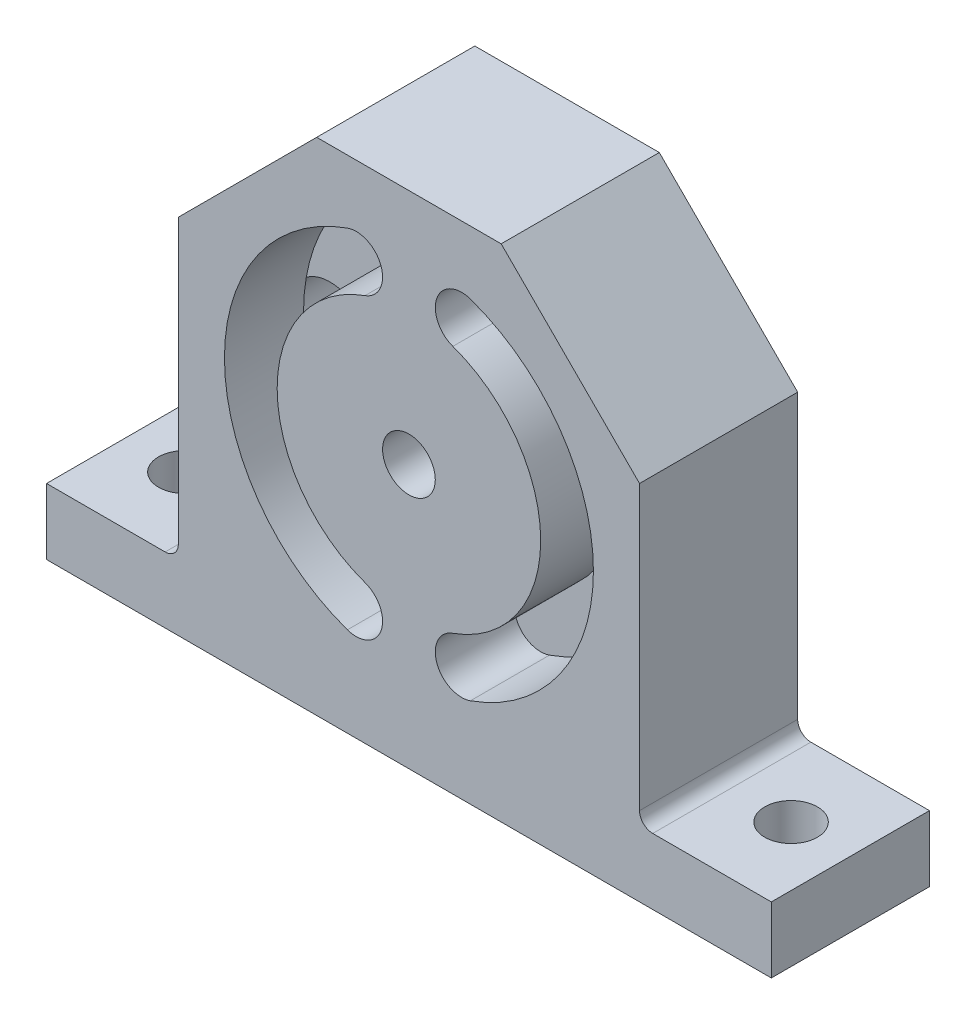
ISO-10303-21;
HEADER;
FILE_DESCRIPTION(('STEP AP214'),'2;1');
FILE_NAME('part.step','',(''),(''),'','','');
FILE_SCHEMA(('AUTOMOTIVE_DESIGN { 1 0 10303 214 1 1 1 1 }'));
ENDSEC;
DATA;
#1=APPLICATION_CONTEXT('core data for automotive mechanical design processes');
#2=APPLICATION_PROTOCOL_DEFINITION('international standard','automotive_design',2000,#1);
#3=PRODUCT_CONTEXT('',#1,'mechanical');
#4=PRODUCT('Part','Part','',(#3));
#5=PRODUCT_RELATED_PRODUCT_CATEGORY('part','',(#4));
#6=PRODUCT_DEFINITION_FORMATION('','',#4);
#7=PRODUCT_DEFINITION_CONTEXT('part definition',#1,'design');
#8=PRODUCT_DEFINITION('design','',#6,#7);
#9=PRODUCT_DEFINITION_SHAPE('','',#8);
#10=(LENGTH_UNIT() NAMED_UNIT(*) SI_UNIT(.MILLI.,.METRE.));
#11=(NAMED_UNIT(*) PLANE_ANGLE_UNIT() SI_UNIT($,.RADIAN.));
#12=(NAMED_UNIT(*) SI_UNIT($,.STERADIAN.) SOLID_ANGLE_UNIT());
#13=UNCERTAINTY_MEASURE_WITH_UNIT(LENGTH_MEASURE(1.E-05),#10,'distance_accuracy_value','');
#14=(GEOMETRIC_REPRESENTATION_CONTEXT(3) GLOBAL_UNCERTAINTY_ASSIGNED_CONTEXT((#13)) GLOBAL_UNIT_ASSIGNED_CONTEXT((#10,
#11,#12)) REPRESENTATION_CONTEXT('',''));
#15=CARTESIAN_POINT('',(0.,0.,0.));
#16=DIRECTION('',(0.,0.,1.));
#17=DIRECTION('',(1.,0.,0.));
#18=AXIS2_PLACEMENT_3D('',#15,#16,#17);
#19=CARTESIAN_POINT('',(25.5,14.3431457505076,0.));
#20=DIRECTION('',(0.,0.,1.));
#21=DIRECTION('',(1.,0.,0.));
#22=AXIS2_PLACEMENT_3D('',#19,#20,#21);
#23=PLANE('',#22);
#24=CARTESIAN_POINT('',(27.5,20.,0.));
#25=DIRECTION('',(0.,0.,1.));
#26=DIRECTION('',(1.,0.,0.));
#27=AXIS2_PLACEMENT_3D('',#24,#25,#26);
#28=CIRCLE('',#27,14.);
#29=CARTESIAN_POINT('',(22.8333333333333,33.1993265821489,0.));
#30=VERTEX_POINT('',#29);
#31=CARTESIAN_POINT('',(13.7083333333333,22.4062274529968,0.));
#32=VERTEX_POINT('',#31);
#33=EDGE_CURVE('E223',#30,#32,#28,.T.);
#34=ORIENTED_EDGE('',*,*,#33,.T.);
#35=CARTESIAN_POINT('',(15.5,20.,0.));
#36=DIRECTION('',(0.,0.,-1.));
#37=DIRECTION('',(-1.,0.,0.));
#38=AXIS2_PLACEMENT_3D('',#35,#36,#37);
#39=CIRCLE('',#38,3.);
#40=CARTESIAN_POINT('',(17.7083333333333,22.0305821551685,0.));
#41=VERTEX_POINT('',#40);
#42=EDGE_CURVE('E207',#32,#41,#39,.T.);
#43=ORIENTED_EDGE('',*,*,#42,.T.);
#44=CARTESIAN_POINT('',(27.5,20.,0.));
#45=DIRECTION('',(0.,0.,-1.));
#46=DIRECTION('',(1.,0.,0.));
#47=AXIS2_PLACEMENT_3D('',#44,#45,#46);
#48=CIRCLE('',#47,10.);
#49=CARTESIAN_POINT('',(24.1666666666667,29.4280904158206,0.));
#50=VERTEX_POINT('',#49);
#51=EDGE_CURVE('E242',#41,#50,#48,.T.);
#52=ORIENTED_EDGE('',*,*,#51,.T.);
#53=CARTESIAN_POINT('',(23.5,31.3137084989848,0.));
#54=DIRECTION('',(0.,0.,1.));
#55=DIRECTION('',(1.,0.,0.));
#56=AXIS2_PLACEMENT_3D('',#53,#54,#55);
#57=CIRCLE('',#56,2.);
#58=EDGE_CURVE('E229',#50,#30,#57,.T.);
#59=ORIENTED_EDGE('',*,*,#58,.T.);
#60=EDGE_LOOP('',(#34,#43,#52,#59));
#61=FACE_BOUND('',#60,.T.);
#62=ADVANCED_FACE('F37',(#61),#23,.T.);
#63=CARTESIAN_POINT('',(29.5,25.6568542494924,0.));
#64=DIRECTION('',(0.,0.,1.));
#65=DIRECTION('',(1.,0.,0.));
#66=AXIS2_PLACEMENT_3D('',#63,#64,#65);
#67=PLANE('',#66);
#68=CARTESIAN_POINT('',(27.5,20.,0.));
#69=DIRECTION('',(0.,0.,-1.));
#70=DIRECTION('',(1.,0.,0.));
#71=AXIS2_PLACEMENT_3D('',#68,#69,#70);
#72=CIRCLE('',#71,9.99999999999999);
#73=CARTESIAN_POINT('',(30.8333333333333,29.4280904158206,0.));
#74=VERTEX_POINT('',#73);
#75=CARTESIAN_POINT('',(37.2916666666667,22.0305821551685,0.));
#76=VERTEX_POINT('',#75);
#77=EDGE_CURVE('E273',#74,#76,#72,.T.);
#78=ORIENTED_EDGE('',*,*,#77,.T.);
#79=CARTESIAN_POINT('',(39.5,20.,0.));
#80=DIRECTION('',(0.,0.,-1.));
#81=DIRECTION('',(-1.,0.,0.));
#82=AXIS2_PLACEMENT_3D('',#79,#80,#81);
#83=CIRCLE('',#82,3.);
#84=CARTESIAN_POINT('',(41.2916666666667,22.4062274529968,0.));
#85=VERTEX_POINT('',#84);
#86=EDGE_CURVE('E291',#76,#85,#83,.T.);
#87=ORIENTED_EDGE('',*,*,#86,.T.);
#88=CARTESIAN_POINT('',(27.5,20.,0.));
#89=DIRECTION('',(0.,0.,1.));
#90=DIRECTION('',(1.,0.,0.));
#91=AXIS2_PLACEMENT_3D('',#88,#89,#90);
#92=CIRCLE('',#91,14.);
#93=CARTESIAN_POINT('',(32.1666666666667,33.1993265821489,0.));
#94=VERTEX_POINT('',#93);
#95=EDGE_CURVE('E261',#85,#94,#92,.T.);
#96=ORIENTED_EDGE('',*,*,#95,.T.);
#97=CARTESIAN_POINT('',(31.5,31.3137084989848,0.));
#98=DIRECTION('',(0.,0.,1.));
#99=DIRECTION('',(-1.,0.,0.));
#100=AXIS2_PLACEMENT_3D('',#97,#98,#99);
#101=CIRCLE('',#100,2.);
#102=EDGE_CURVE('E278',#94,#74,#101,.T.);
#103=ORIENTED_EDGE('',*,*,#102,.T.);
#104=EDGE_LOOP('',(#78,#87,#96,#103));
#105=FACE_BOUND('',#104,.T.);
#106=ADVANCED_FACE('F464',(#105),#67,.T.);
#107=CARTESIAN_POINT('',(0.,0.,6.));
#108=DIRECTION('',(0.,0.,1.));
#109=DIRECTION('',(1.,0.,0.));
#110=AXIS2_PLACEMENT_3D('',#107,#108,#109);
#111=PLANE('',#110);
#112=CARTESIAN_POINT('',(23.5,8.68629150101523,6.));
#113=DIRECTION('',(0.,0.,1.));
#114=DIRECTION('',(1.,0.,0.));
#115=AXIS2_PLACEMENT_3D('',#112,#113,#114);
#116=CIRCLE('',#115,2.);
#117=CARTESIAN_POINT('',(22.8333333333333,6.8006734178511,6.));
#118=VERTEX_POINT('',#117);
#119=CARTESIAN_POINT('',(24.1666666666667,10.5719095841794,6.));
#120=VERTEX_POINT('',#119);
#121=EDGE_CURVE('E294',#118,#120,#116,.T.);
#122=ORIENTED_EDGE('',*,*,#121,.F.);
#123=CARTESIAN_POINT('',(27.5,20.,6.));
#124=DIRECTION('',(0.,0.,1.));
#125=DIRECTION('',(1.,0.,0.));
#126=AXIS2_PLACEMENT_3D('',#123,#124,#125);
#127=CIRCLE('',#126,14.);
#128=CARTESIAN_POINT('',(22.8333333333333,33.1993265821489,6.));
#129=VERTEX_POINT('',#128);
#130=EDGE_CURVE('E246',#129,#118,#127,.T.);
#131=ORIENTED_EDGE('',*,*,#130,.F.);
#132=CARTESIAN_POINT('',(23.5,31.3137084989848,6.));
#133=DIRECTION('',(0.,0.,1.));
#134=DIRECTION('',(1.,0.,0.));
#135=AXIS2_PLACEMENT_3D('',#132,#133,#134);
#136=CIRCLE('',#135,2.);
#137=CARTESIAN_POINT('',(24.1666666666667,29.4280904158206,6.));
#138=VERTEX_POINT('',#137);
#139=EDGE_CURVE('E500',#138,#129,#136,.T.);
#140=ORIENTED_EDGE('',*,*,#139,.F.);
#141=CARTESIAN_POINT('',(27.5,20.,6.));
#142=DIRECTION('',(0.,0.,-1.));
#143=DIRECTION('',(1.,0.,0.));
#144=AXIS2_PLACEMENT_3D('',#141,#142,#143);
#145=CIRCLE('',#144,10.);
#146=EDGE_CURVE('E494',#120,#138,#145,.T.);
#147=ORIENTED_EDGE('',*,*,#146,.F.);
#148=EDGE_LOOP('',(#122,#131,#140,#147));
#149=FACE_BOUND('',#148,.T.);
#150=CARTESIAN_POINT('',(27.5,20.,6.));
#151=DIRECTION('',(0.,0.,1.));
#152=DIRECTION('',(1.,0.,0.));
#153=AXIS2_PLACEMENT_3D('',#150,#151,#152);
#154=CIRCLE('',#153,2.);
#155=CARTESIAN_POINT('',(29.5,20.,6.));
#156=VERTEX_POINT('',#155);
#157=EDGE_CURVE('E257',#156,#156,#154,.T.);
#158=ORIENTED_EDGE('',*,*,#157,.F.);
#159=EDGE_LOOP('',(#158));
#160=FACE_BOUND('',#159,.T.);
#161=DIRECTION('',(0.,-1.,0.));
#162=VECTOR('',#161,1.);
#163=CARTESIAN_POINT('',(0.,5.,6.));
#164=LINE('',#163,#162);
#165=CARTESIAN_POINT('',(0.,5.,6.));
#166=VERTEX_POINT('',#165);
#167=CARTESIAN_POINT('',(0.,0.,6.));
#168=VERTEX_POINT('',#167);
#169=EDGE_CURVE('E396',#166,#168,#164,.T.);
#170=ORIENTED_EDGE('',*,*,#169,.T.);
#171=DIRECTION('',(1.,0.,0.));
#172=VECTOR('',#171,1.);
#173=CARTESIAN_POINT('',(0.,0.,6.));
#174=LINE('',#173,#172);
#175=CARTESIAN_POINT('',(55.,0.,6.));
#176=VERTEX_POINT('',#175);
#177=EDGE_CURVE('E450',#168,#176,#174,.T.);
#178=ORIENTED_EDGE('',*,*,#177,.T.);
#179=DIRECTION('',(0.,1.,0.));
#180=VECTOR('',#179,1.);
#181=CARTESIAN_POINT('',(55.,0.,6.));
#182=LINE('',#181,#180);
#183=CARTESIAN_POINT('',(55.,5.00000000000001,6.));
#184=VERTEX_POINT('',#183);
#185=EDGE_CURVE('E418',#176,#184,#182,.T.);
#186=ORIENTED_EDGE('',*,*,#185,.T.);
#187=DIRECTION('',(-1.,0.,0.));
#188=VECTOR('',#187,1.);
#189=CARTESIAN_POINT('',(55.,5.00000000000001,6.));
#190=LINE('',#189,#188);
#191=CARTESIAN_POINT('',(46.,5.,6.));
#192=VERTEX_POINT('',#191);
#193=EDGE_CURVE('E428',#184,#192,#190,.T.);
#194=ORIENTED_EDGE('',*,*,#193,.T.);
#195=CARTESIAN_POINT('',(46.,6.,6.));
#196=DIRECTION('',(0.,0.,1.));
#197=DIRECTION('',(1.,0.,0.));
#198=AXIS2_PLACEMENT_3D('',#195,#196,#197);
#199=CIRCLE('',#198,1.);
#200=CARTESIAN_POINT('',(45.,6.,6.));
#201=VERTEX_POINT('',#200);
#202=EDGE_CURVE('E11',#192,#201,#199,.F.);
#203=ORIENTED_EDGE('',*,*,#202,.T.);
#204=DIRECTION('',(0.,1.,0.));
#205=VECTOR('',#204,1.);
#206=CARTESIAN_POINT('',(45.,5.,6.));
#207=LINE('',#206,#205);
#208=CARTESIAN_POINT('',(45.,27.5,6.));
#209=VERTEX_POINT('',#208);
#210=EDGE_CURVE('E426',#201,#209,#207,.T.);
#211=ORIENTED_EDGE('',*,*,#210,.T.);
#212=DIRECTION('',(-0.707106781186547,0.707106781186548,0.));
#213=VECTOR('',#212,1.);
#214=CARTESIAN_POINT('',(45.,27.5,6.));
#215=LINE('',#214,#213);
#216=CARTESIAN_POINT('',(34.5,38.,6.));
#217=VERTEX_POINT('',#216);
#218=EDGE_CURVE('E432',#209,#217,#215,.T.);
#219=ORIENTED_EDGE('',*,*,#218,.T.);
#220=DIRECTION('',(-1.,0.,0.));
#221=VECTOR('',#220,1.);
#222=CARTESIAN_POINT('',(34.5,38.,6.));
#223=LINE('',#222,#221);
#224=CARTESIAN_POINT('',(20.5,38.,6.));
#225=VERTEX_POINT('',#224);
#226=EDGE_CURVE('E369',#217,#225,#223,.T.);
#227=ORIENTED_EDGE('',*,*,#226,.T.);
#228=DIRECTION('',(-0.707106781186548,-0.707106781186547,0.));
#229=VECTOR('',#228,1.);
#230=CARTESIAN_POINT('',(20.5,38.,6.));
#231=LINE('',#230,#229);
#232=CARTESIAN_POINT('',(10.,27.5,6.));
#233=VERTEX_POINT('',#232);
#234=EDGE_CURVE('E364',#225,#233,#231,.T.);
#235=ORIENTED_EDGE('',*,*,#234,.T.);
#236=DIRECTION('',(0.,-1.,0.));
#237=VECTOR('',#236,1.);
#238=CARTESIAN_POINT('',(10.,27.5,6.));
#239=LINE('',#238,#237);
#240=CARTESIAN_POINT('',(10.,6.00000000000001,6.));
#241=VERTEX_POINT('',#240);
#242=EDGE_CURVE('E337',#233,#241,#239,.T.);
#243=ORIENTED_EDGE('',*,*,#242,.T.);
#244=CARTESIAN_POINT('',(9.,6.,6.));
#245=DIRECTION('',(0.,0.,1.));
#246=DIRECTION('',(1.,0.,0.));
#247=AXIS2_PLACEMENT_3D('',#244,#245,#246);
#248=CIRCLE('',#247,1.);
#249=CARTESIAN_POINT('',(9.,5.,6.));
#250=VERTEX_POINT('',#249);
#251=EDGE_CURVE('E343',#241,#250,#248,.F.);
#252=ORIENTED_EDGE('',*,*,#251,.T.);
#253=DIRECTION('',(-1.,0.,0.));
#254=VECTOR('',#253,1.);
#255=CARTESIAN_POINT('',(10.,5.,6.));
#256=LINE('',#255,#254);
#257=EDGE_CURVE('E328',#250,#166,#256,.T.);
#258=ORIENTED_EDGE('',*,*,#257,.T.);
#259=EDGE_LOOP('',(#170,#178,#186,#194,#203,#211,#219,#227,#235,#243,#252,#258));
#260=FACE_BOUND('',#259,.T.);
#261=CARTESIAN_POINT('',(27.5,20.,6.));
#262=DIRECTION('',(0.,0.,1.));
#263=DIRECTION('',(1.,0.,0.));
#264=AXIS2_PLACEMENT_3D('',#261,#262,#263);
#265=CIRCLE('',#264,14.);
#266=CARTESIAN_POINT('',(32.1666666666667,6.8006734178511,6.));
#267=VERTEX_POINT('',#266);
#268=CARTESIAN_POINT('',(32.1666666666667,33.1993265821489,6.));
#269=VERTEX_POINT('',#268);
#270=EDGE_CURVE('E268',#267,#269,#265,.T.);
#271=ORIENTED_EDGE('',*,*,#270,.F.);
#272=CARTESIAN_POINT('',(31.5,8.68629150101523,6.));
#273=DIRECTION('',(0.,0.,1.));
#274=DIRECTION('',(-1.,0.,0.));
#275=AXIS2_PLACEMENT_3D('',#272,#273,#274);
#276=CIRCLE('',#275,2.00000000000001);
#277=CARTESIAN_POINT('',(30.8333333333333,10.5719095841794,6.));
#278=VERTEX_POINT('',#277);
#279=EDGE_CURVE('E258',#278,#267,#276,.T.);
#280=ORIENTED_EDGE('',*,*,#279,.F.);
#281=CARTESIAN_POINT('',(27.5,20.,6.));
#282=DIRECTION('',(0.,0.,-1.));
#283=DIRECTION('',(1.,0.,0.));
#284=AXIS2_PLACEMENT_3D('',#281,#282,#283);
#285=CIRCLE('',#284,9.99999999999999);
#286=CARTESIAN_POINT('',(30.8333333333333,29.4280904158206,6.));
#287=VERTEX_POINT('',#286);
#288=EDGE_CURVE('E262',#287,#278,#285,.T.);
#289=ORIENTED_EDGE('',*,*,#288,.F.);
#290=CARTESIAN_POINT('',(31.5,31.3137084989848,6.));
#291=DIRECTION('',(0.,0.,1.));
#292=DIRECTION('',(-1.,0.,0.));
#293=AXIS2_PLACEMENT_3D('',#290,#291,#292);
#294=CIRCLE('',#293,2.);
#295=EDGE_CURVE('E265',#269,#287,#294,.T.);
#296=ORIENTED_EDGE('',*,*,#295,.F.);
#297=EDGE_LOOP('',(#271,#280,#289,#296));
#298=FACE_BOUND('',#297,.T.);
#299=ADVANCED_FACE('F360',(#149,#160,#260,#298),#111,.T.);
#300=CARTESIAN_POINT('',(0.,5.,6.));
#301=DIRECTION('',(1.,0.,0.));
#302=DIRECTION('',(0.,1.,0.));
#303=AXIS2_PLACEMENT_3D('',#300,#301,#302);
#304=PLANE('',#303);
#305=DIRECTION('',(0.,-1.,0.));
#306=VECTOR('',#305,1.);
#307=CARTESIAN_POINT('',(0.,5.,-6.));
#308=LINE('',#307,#306);
#309=CARTESIAN_POINT('',(0.,5.,-6.));
#310=VERTEX_POINT('',#309);
#311=CARTESIAN_POINT('',(0.,0.,-6.));
#312=VERTEX_POINT('',#311);
#313=EDGE_CURVE('E373',#310,#312,#308,.T.);
#314=ORIENTED_EDGE('',*,*,#313,.T.);
#315=DIRECTION('',(0.,0.,-1.));
#316=VECTOR('',#315,1.);
#317=CARTESIAN_POINT('',(0.,0.,6.));
#318=LINE('',#317,#316);
#319=EDGE_CURVE('E346',#168,#312,#318,.T.);
#320=ORIENTED_EDGE('',*,*,#319,.F.);
#321=ORIENTED_EDGE('',*,*,#169,.F.);
#322=DIRECTION('',(0.,0.,-1.));
#323=VECTOR('',#322,1.);
#324=CARTESIAN_POINT('',(0.,5.,6.));
#325=LINE('',#324,#323);
#326=EDGE_CURVE('E333',#166,#310,#325,.T.);
#327=ORIENTED_EDGE('',*,*,#326,.T.);
#328=EDGE_LOOP('',(#314,#320,#321,#327));
#329=FACE_BOUND('',#328,.T.);
#330=ADVANCED_FACE('F448',(#329),#304,.F.);
#331=CARTESIAN_POINT('',(0.,0.,6.));
#332=DIRECTION('',(0.,1.,0.));
#333=DIRECTION('',(-1.,0.,0.));
#334=AXIS2_PLACEMENT_3D('',#331,#332,#333);
#335=PLANE('',#334);
#336=CARTESIAN_POINT('',(4.50000000000003,0.,0.));
#337=DIRECTION('',(0.,1.,0.));
#338=DIRECTION('',(-1.,0.,0.));
#339=AXIS2_PLACEMENT_3D('',#336,#337,#338);
#340=CIRCLE('',#339,2.);
#341=CARTESIAN_POINT('',(2.50000000000003,0.,0.));
#342=VERTEX_POINT('',#341);
#343=EDGE_CURVE('E286',#342,#342,#340,.T.);
#344=ORIENTED_EDGE('',*,*,#343,.T.);
#345=EDGE_LOOP('',(#344));
#346=FACE_BOUND('',#345,.T.);
#347=CARTESIAN_POINT('',(50.5,0.,0.));
#348=DIRECTION('',(0.,1.,0.));
#349=DIRECTION('',(-1.,0.,0.));
#350=AXIS2_PLACEMENT_3D('',#347,#348,#349);
#351=CIRCLE('',#350,2.);
#352=CARTESIAN_POINT('',(48.5,0.,0.));
#353=VERTEX_POINT('',#352);
#354=EDGE_CURVE('E299',#353,#353,#351,.T.);
#355=ORIENTED_EDGE('',*,*,#354,.T.);
#356=EDGE_LOOP('',(#355));
#357=FACE_BOUND('',#356,.T.);
#358=DIRECTION('',(1.,0.,0.));
#359=VECTOR('',#358,1.);
#360=CARTESIAN_POINT('',(0.,0.,-6.));
#361=LINE('',#360,#359);
#362=CARTESIAN_POINT('',(55.,0.,-6.));
#363=VERTEX_POINT('',#362);
#364=EDGE_CURVE('E376',#312,#363,#361,.T.);
#365=ORIENTED_EDGE('',*,*,#364,.T.);
#366=DIRECTION('',(0.,0.,-1.));
#367=VECTOR('',#366,1.);
#368=CARTESIAN_POINT('',(55.,0.,6.));
#369=LINE('',#368,#367);
#370=EDGE_CURVE('E351',#176,#363,#369,.T.);
#371=ORIENTED_EDGE('',*,*,#370,.F.);
#372=ORIENTED_EDGE('',*,*,#177,.F.);
#373=ORIENTED_EDGE('',*,*,#319,.T.);
#374=EDGE_LOOP('',(#365,#371,#372,#373));
#375=FACE_BOUND('',#374,.T.);
#376=ADVANCED_FACE('F308',(#346,#357,#375),#335,.F.);
#377=CARTESIAN_POINT('',(55.,0.,6.));
#378=DIRECTION('',(-1.,0.,0.));
#379=DIRECTION('',(0.,0.,1.));
#380=AXIS2_PLACEMENT_3D('',#377,#378,#379);
#381=PLANE('',#380);
#382=DIRECTION('',(0.,1.,0.));
#383=VECTOR('',#382,1.);
#384=CARTESIAN_POINT('',(55.,0.,-6.));
#385=LINE('',#384,#383);
#386=CARTESIAN_POINT('',(55.,5.00000000000001,-6.));
#387=VERTEX_POINT('',#386);
#388=EDGE_CURVE('E379',#363,#387,#385,.T.);
#389=ORIENTED_EDGE('',*,*,#388,.T.);
#390=DIRECTION('',(0.,0.,-1.));
#391=VECTOR('',#390,1.);
#392=CARTESIAN_POINT('',(55.,5.00000000000001,6.));
#393=LINE('',#392,#391);
#394=EDGE_CURVE('E409',#184,#387,#393,.T.);
#395=ORIENTED_EDGE('',*,*,#394,.F.);
#396=ORIENTED_EDGE('',*,*,#185,.F.);
#397=ORIENTED_EDGE('',*,*,#370,.T.);
#398=EDGE_LOOP('',(#389,#395,#396,#397));
#399=FACE_BOUND('',#398,.T.);
#400=ADVANCED_FACE('F416',(#399),#381,.F.);
#401=CARTESIAN_POINT('',(55.,5.00000000000001,6.));
#402=DIRECTION('',(0.,-1.,0.));
#403=DIRECTION('',(1.,0.,0.));
#404=AXIS2_PLACEMENT_3D('',#401,#402,#403);
#405=PLANE('',#404);
#406=CARTESIAN_POINT('',(50.5,5.,0.));
#407=DIRECTION('',(0.,1.,0.));
#408=DIRECTION('',(-1.,0.,0.));
#409=AXIS2_PLACEMENT_3D('',#406,#407,#408);
#410=CIRCLE('',#409,2.);
#411=CARTESIAN_POINT('',(48.5,5.,0.));
#412=VERTEX_POINT('',#411);
#413=EDGE_CURVE('E296',#412,#412,#410,.T.);
#414=ORIENTED_EDGE('',*,*,#413,.F.);
#415=EDGE_LOOP('',(#414));
#416=FACE_BOUND('',#415,.T.);
#417=DIRECTION('',(-1.,0.,0.));
#418=VECTOR('',#417,1.);
#419=CARTESIAN_POINT('',(55.,5.00000000000001,-6.));
#420=LINE('',#419,#418);
#421=CARTESIAN_POINT('',(46.,5.,-6.));
#422=VERTEX_POINT('',#421);
#423=EDGE_CURVE('E381',#387,#422,#420,.T.);
#424=ORIENTED_EDGE('',*,*,#423,.T.);
#425=DIRECTION('',(0.,0.,-1.));
#426=VECTOR('',#425,1.);
#427=CARTESIAN_POINT('',(46.,5.,6.));
#428=LINE('',#427,#426);
#429=EDGE_CURVE('E52',#422,#192,#428,.F.);
#430=ORIENTED_EDGE('',*,*,#429,.T.);
#431=ORIENTED_EDGE('',*,*,#193,.F.);
#432=ORIENTED_EDGE('',*,*,#394,.T.);
#433=EDGE_LOOP('',(#424,#430,#431,#432));
#434=FACE_BOUND('',#433,.T.);
#435=ADVANCED_FACE('F421',(#416,#434),#405,.F.);
#436=CARTESIAN_POINT('',(45.,5.,6.));
#437=DIRECTION('',(-1.,0.,0.));
#438=DIRECTION('',(0.,0.,1.));
#439=AXIS2_PLACEMENT_3D('',#436,#437,#438);
#440=PLANE('',#439);
#441=ORIENTED_EDGE('',*,*,#210,.F.);
#442=DIRECTION('',(0.,0.,-1.));
#443=VECTOR('',#442,1.);
#444=CARTESIAN_POINT('',(45.,6.,-6.));
#445=LINE('',#444,#443);
#446=CARTESIAN_POINT('',(45.,6.,-6.));
#447=VERTEX_POINT('',#446);
#448=EDGE_CURVE('E348',#201,#447,#445,.T.);
#449=ORIENTED_EDGE('',*,*,#448,.T.);
#450=DIRECTION('',(0.,1.,0.));
#451=VECTOR('',#450,1.);
#452=CARTESIAN_POINT('',(45.,5.,-6.));
#453=LINE('',#452,#451);
#454=CARTESIAN_POINT('',(45.,27.5,-6.));
#455=VERTEX_POINT('',#454);
#456=EDGE_CURVE('E383',#447,#455,#453,.T.);
#457=ORIENTED_EDGE('',*,*,#456,.T.);
#458=DIRECTION('',(0.,0.,-1.));
#459=VECTOR('',#458,1.);
#460=CARTESIAN_POINT('',(45.,27.5,6.));
#461=LINE('',#460,#459);
#462=EDGE_CURVE('E406',#209,#455,#461,.T.);
#463=ORIENTED_EDGE('',*,*,#462,.F.);
#464=EDGE_LOOP('',(#441,#449,#457,#463));
#465=FACE_BOUND('',#464,.T.);
#466=ADVANCED_FACE('F430',(#465),#440,.F.);
#467=CARTESIAN_POINT('',(45.,27.5,6.));
#468=DIRECTION('',(-0.707106781186548,-0.707106781186547,0.));
#469=DIRECTION('',(0.707106781186547,-0.707106781186548,0.));
#470=AXIS2_PLACEMENT_3D('',#467,#468,#469);
#471=PLANE('',#470);
#472=DIRECTION('',(-0.707106781186547,0.707106781186548,0.));
#473=VECTOR('',#472,1.);
#474=CARTESIAN_POINT('',(45.,27.5,-6.));
#475=LINE('',#474,#473);
#476=CARTESIAN_POINT('',(34.5,38.,-6.));
#477=VERTEX_POINT('',#476);
#478=EDGE_CURVE('E385',#455,#477,#475,.T.);
#479=ORIENTED_EDGE('',*,*,#478,.T.);
#480=DIRECTION('',(0.,0.,-1.));
#481=VECTOR('',#480,1.);
#482=CARTESIAN_POINT('',(34.5,38.,6.));
#483=LINE('',#482,#481);
#484=EDGE_CURVE('E403',#217,#477,#483,.T.);
#485=ORIENTED_EDGE('',*,*,#484,.F.);
#486=ORIENTED_EDGE('',*,*,#218,.F.);
#487=ORIENTED_EDGE('',*,*,#462,.T.);
#488=EDGE_LOOP('',(#479,#485,#486,#487));
#489=FACE_BOUND('',#488,.T.);
#490=ADVANCED_FACE('F531',(#489),#471,.F.);
#491=CARTESIAN_POINT('',(34.5,38.,6.));
#492=DIRECTION('',(0.,-1.,0.));
#493=DIRECTION('',(1.,0.,0.));
#494=AXIS2_PLACEMENT_3D('',#491,#492,#493);
#495=PLANE('',#494);
#496=DIRECTION('',(-1.,0.,0.));
#497=VECTOR('',#496,1.);
#498=CARTESIAN_POINT('',(34.5,38.,-6.));
#499=LINE('',#498,#497);
#500=CARTESIAN_POINT('',(20.5,38.,-6.));
#501=VERTEX_POINT('',#500);
#502=EDGE_CURVE('E387',#477,#501,#499,.T.);
#503=ORIENTED_EDGE('',*,*,#502,.T.);
#504=DIRECTION('',(0.,0.,-1.));
#505=VECTOR('',#504,1.);
#506=CARTESIAN_POINT('',(20.5,38.,6.));
#507=LINE('',#506,#505);
#508=EDGE_CURVE('E400',#225,#501,#507,.T.);
#509=ORIENTED_EDGE('',*,*,#508,.F.);
#510=ORIENTED_EDGE('',*,*,#226,.F.);
#511=ORIENTED_EDGE('',*,*,#484,.T.);
#512=EDGE_LOOP('',(#503,#509,#510,#511));
#513=FACE_BOUND('',#512,.T.);
#514=ADVANCED_FACE('F441',(#513),#495,.F.);
#515=CARTESIAN_POINT('',(20.5,38.,6.));
#516=DIRECTION('',(0.707106781186547,-0.707106781186548,0.));
#517=DIRECTION('',(0.707106781186548,0.707106781186547,0.));
#518=AXIS2_PLACEMENT_3D('',#515,#516,#517);
#519=PLANE('',#518);
#520=DIRECTION('',(-0.707106781186548,-0.707106781186547,0.));
#521=VECTOR('',#520,1.);
#522=CARTESIAN_POINT('',(20.5,38.,-6.));
#523=LINE('',#522,#521);
#524=CARTESIAN_POINT('',(10.,27.5,-6.));
#525=VERTEX_POINT('',#524);
#526=EDGE_CURVE('E389',#501,#525,#523,.T.);
#527=ORIENTED_EDGE('',*,*,#526,.T.);
#528=DIRECTION('',(0.,0.,-1.));
#529=VECTOR('',#528,1.);
#530=CARTESIAN_POINT('',(10.,27.5,6.));
#531=LINE('',#530,#529);
#532=EDGE_CURVE('E398',#233,#525,#531,.T.);
#533=ORIENTED_EDGE('',*,*,#532,.F.);
#534=ORIENTED_EDGE('',*,*,#234,.F.);
#535=ORIENTED_EDGE('',*,*,#508,.T.);
#536=EDGE_LOOP('',(#527,#533,#534,#535));
#537=FACE_BOUND('',#536,.T.);
#538=ADVANCED_FACE('F445',(#537),#519,.F.);
#539=CARTESIAN_POINT('',(10.,27.5,6.));
#540=DIRECTION('',(1.,0.,0.));
#541=DIRECTION('',(0.,0.,-1.));
#542=AXIS2_PLACEMENT_3D('',#539,#540,#541);
#543=PLANE('',#542);
#544=DIRECTION('',(0.,-1.,0.));
#545=VECTOR('',#544,1.);
#546=CARTESIAN_POINT('',(10.,27.5,-6.));
#547=LINE('',#546,#545);
#548=CARTESIAN_POINT('',(10.,6.00000000000001,-6.));
#549=VERTEX_POINT('',#548);
#550=EDGE_CURVE('E391',#525,#549,#547,.T.);
#551=ORIENTED_EDGE('',*,*,#550,.T.);
#552=DIRECTION('',(0.,0.,-1.));
#553=VECTOR('',#552,1.);
#554=CARTESIAN_POINT('',(10.,6.,6.));
#555=LINE('',#554,#553);
#556=EDGE_CURVE('E345',#549,#241,#555,.F.);
#557=ORIENTED_EDGE('',*,*,#556,.T.);
#558=ORIENTED_EDGE('',*,*,#242,.F.);
#559=ORIENTED_EDGE('',*,*,#532,.T.);
#560=EDGE_LOOP('',(#551,#557,#558,#559));
#561=FACE_BOUND('',#560,.T.);
#562=ADVANCED_FACE('F323',(#561),#543,.F.);
#563=CARTESIAN_POINT('',(10.,5.,6.));
#564=DIRECTION('',(0.,-1.,0.));
#565=DIRECTION('',(0.,0.,-1.));
#566=AXIS2_PLACEMENT_3D('',#563,#564,#565);
#567=PLANE('',#566);
#568=CARTESIAN_POINT('',(4.50000000000003,4.99999999999997,0.));
#569=DIRECTION('',(0.,1.,0.));
#570=DIRECTION('',(-1.,0.,0.));
#571=AXIS2_PLACEMENT_3D('',#568,#569,#570);
#572=CIRCLE('',#571,2.);
#573=CARTESIAN_POINT('',(2.50000000000003,4.99999999999997,0.));
#574=VERTEX_POINT('',#573);
#575=EDGE_CURVE('E302',#574,#574,#572,.T.);
#576=ORIENTED_EDGE('',*,*,#575,.F.);
#577=EDGE_LOOP('',(#576));
#578=FACE_BOUND('',#577,.T.);
#579=ORIENTED_EDGE('',*,*,#257,.F.);
#580=DIRECTION('',(0.,0.,-1.));
#581=VECTOR('',#580,1.);
#582=CARTESIAN_POINT('',(9.,5.,-6.));
#583=LINE('',#582,#581);
#584=CARTESIAN_POINT('',(9.,5.,-6.));
#585=VERTEX_POINT('',#584);
#586=EDGE_CURVE('E330',#250,#585,#583,.T.);
#587=ORIENTED_EDGE('',*,*,#586,.T.);
#588=DIRECTION('',(-1.,0.,0.));
#589=VECTOR('',#588,1.);
#590=CARTESIAN_POINT('',(10.,5.,-6.));
#591=LINE('',#590,#589);
#592=EDGE_CURVE('E394',#585,#310,#591,.T.);
#593=ORIENTED_EDGE('',*,*,#592,.T.);
#594=ORIENTED_EDGE('',*,*,#326,.F.);
#595=EDGE_LOOP('',(#579,#587,#593,#594));
#596=FACE_BOUND('',#595,.T.);
#597=ADVANCED_FACE('F319',(#578,#596),#567,.F.);
#598=CARTESIAN_POINT('',(0.,0.,-6.));
#599=DIRECTION('',(0.,0.,1.));
#600=DIRECTION('',(1.,0.,0.));
#601=AXIS2_PLACEMENT_3D('',#598,#599,#600);
#602=PLANE('',#601);
#603=CARTESIAN_POINT('',(39.5,20.,-6.));
#604=DIRECTION('',(0.,0.,-1.));
#605=DIRECTION('',(-1.,0.,0.));
#606=AXIS2_PLACEMENT_3D('',#603,#604,#605);
#607=CIRCLE('',#606,3.);
#608=CARTESIAN_POINT('',(36.5,20.,-6.));
#609=VERTEX_POINT('',#608);
#610=EDGE_CURVE('E217',#609,#609,#607,.T.);
#611=ORIENTED_EDGE('',*,*,#610,.F.);
#612=EDGE_LOOP('',(#611));
#613=FACE_BOUND('',#612,.T.);
#614=CARTESIAN_POINT('',(15.5,20.,-6.));
#615=DIRECTION('',(0.,0.,-1.));
#616=DIRECTION('',(-1.,0.,0.));
#617=AXIS2_PLACEMENT_3D('',#614,#615,#616);
#618=CIRCLE('',#617,3.);
#619=CARTESIAN_POINT('',(12.5,20.,-6.));
#620=VERTEX_POINT('',#619);
#621=EDGE_CURVE('E205',#620,#620,#618,.T.);
#622=ORIENTED_EDGE('',*,*,#621,.F.);
#623=EDGE_LOOP('',(#622));
#624=FACE_BOUND('',#623,.T.);
#625=CARTESIAN_POINT('',(27.5,20.,-6.));
#626=DIRECTION('',(0.,0.,1.));
#627=DIRECTION('',(1.,0.,0.));
#628=AXIS2_PLACEMENT_3D('',#625,#626,#627);
#629=CIRCLE('',#628,2.);
#630=CARTESIAN_POINT('',(29.5,20.,-6.));
#631=VERTEX_POINT('',#630);
#632=EDGE_CURVE('E377',#631,#631,#629,.T.);
#633=ORIENTED_EDGE('',*,*,#632,.T.);
#634=EDGE_LOOP('',(#633));
#635=FACE_BOUND('',#634,.T.);
#636=ORIENTED_EDGE('',*,*,#313,.F.);
#637=ORIENTED_EDGE('',*,*,#592,.F.);
#638=CARTESIAN_POINT('',(9.,6.,-6.));
#639=DIRECTION('',(0.,0.,1.));
#640=DIRECTION('',(1.,0.,0.));
#641=AXIS2_PLACEMENT_3D('',#638,#639,#640);
#642=CIRCLE('',#641,1.);
#643=EDGE_CURVE('E344',#585,#549,#642,.T.);
#644=ORIENTED_EDGE('',*,*,#643,.T.);
#645=ORIENTED_EDGE('',*,*,#550,.F.);
#646=ORIENTED_EDGE('',*,*,#526,.F.);
#647=ORIENTED_EDGE('',*,*,#502,.F.);
#648=ORIENTED_EDGE('',*,*,#478,.F.);
#649=ORIENTED_EDGE('',*,*,#456,.F.);
#650=CARTESIAN_POINT('',(46.,6.,-6.));
#651=DIRECTION('',(0.,0.,1.));
#652=DIRECTION('',(1.,0.,0.));
#653=AXIS2_PLACEMENT_3D('',#650,#651,#652);
#654=CIRCLE('',#653,1.);
#655=EDGE_CURVE('E45',#447,#422,#654,.T.);
#656=ORIENTED_EDGE('',*,*,#655,.T.);
#657=ORIENTED_EDGE('',*,*,#423,.F.);
#658=ORIENTED_EDGE('',*,*,#388,.F.);
#659=ORIENTED_EDGE('',*,*,#364,.F.);
#660=EDGE_LOOP('',(#636,#637,#644,#645,#646,#647,#648,#649,#656,#657,#658,#659));
#661=FACE_BOUND('',#660,.T.);
#662=ADVANCED_FACE('F322',(#613,#624,#635,#661),#602,.F.);
#663=CARTESIAN_POINT('',(27.5,20.,-6.));
#664=DIRECTION('',(0.,0.,1.));
#665=DIRECTION('',(1.,0.,0.));
#666=AXIS2_PLACEMENT_3D('',#663,#664,#665);
#667=CYLINDRICAL_SURFACE('',#666,2.);
#668=ORIENTED_EDGE('',*,*,#632,.F.);
#669=EDGE_LOOP('',(#668));
#670=FACE_BOUND('',#669,.T.);
#671=ORIENTED_EDGE('',*,*,#157,.T.);
#672=EDGE_LOOP('',(#671));
#673=FACE_BOUND('',#672,.T.);
#674=ADVANCED_FACE('F511',(#670,#673),#667,.F.);
#675=CARTESIAN_POINT('',(23.5,8.68629150101523,0.));
#676=DIRECTION('',(0.,0.,1.));
#677=DIRECTION('',(1.,0.,0.));
#678=AXIS2_PLACEMENT_3D('',#675,#676,#677);
#679=CYLINDRICAL_SURFACE('',#678,2.);
#680=ORIENTED_EDGE('',*,*,#121,.T.);
#681=DIRECTION('',(0.,0.,1.));
#682=VECTOR('',#681,1.);
#683=CARTESIAN_POINT('',(24.1666666666667,10.5719095841794,0.));
#684=LINE('',#683,#682);
#685=CARTESIAN_POINT('',(24.1666666666667,10.5719095841794,0.));
#686=VERTEX_POINT('',#685);
#687=EDGE_CURVE('E230',#686,#120,#684,.T.);
#688=ORIENTED_EDGE('',*,*,#687,.F.);
#689=CARTESIAN_POINT('',(23.5,8.68629150101523,0.));
#690=DIRECTION('',(0.,0.,1.));
#691=DIRECTION('',(1.,0.,0.));
#692=AXIS2_PLACEMENT_3D('',#689,#690,#691);
#693=CIRCLE('',#692,2.);
#694=CARTESIAN_POINT('',(22.8333333333333,6.8006734178511,0.));
#695=VERTEX_POINT('',#694);
#696=EDGE_CURVE('E244',#695,#686,#693,.T.);
#697=ORIENTED_EDGE('',*,*,#696,.F.);
#698=DIRECTION('',(0.,0.,1.));
#699=VECTOR('',#698,1.);
#700=CARTESIAN_POINT('',(22.8333333333333,6.8006734178511,0.));
#701=LINE('',#700,#699);
#702=EDGE_CURVE('E270',#695,#118,#701,.T.);
#703=ORIENTED_EDGE('',*,*,#702,.T.);
#704=EDGE_LOOP('',(#680,#688,#697,#703));
#705=FACE_BOUND('',#704,.T.);
#706=ADVANCED_FACE('F680',(#705),#679,.F.);
#707=CARTESIAN_POINT('',(27.5,20.,0.));
#708=DIRECTION('',(0.,0.,1.));
#709=DIRECTION('',(1.,0.,0.));
#710=AXIS2_PLACEMENT_3D('',#707,#708,#709);
#711=CYLINDRICAL_SURFACE('',#710,14.);
#712=ORIENTED_EDGE('',*,*,#130,.T.);
#713=ORIENTED_EDGE('',*,*,#702,.F.);
#714=CARTESIAN_POINT('',(13.7083333333333,17.5937725470032,0.));
#715=VERTEX_POINT('',#714);
#716=EDGE_CURVE('E225',#715,#695,#28,.T.);
#717=ORIENTED_EDGE('',*,*,#716,.F.);
#718=EDGE_CURVE('E201',#32,#715,#28,.T.);
#719=ORIENTED_EDGE('',*,*,#718,.F.);
#720=ORIENTED_EDGE('',*,*,#33,.F.);
#721=DIRECTION('',(0.,0.,1.));
#722=VECTOR('',#721,1.);
#723=CARTESIAN_POINT('',(22.8333333333333,33.1993265821489,0.));
#724=LINE('',#723,#722);
#725=EDGE_CURVE('E498',#30,#129,#724,.T.);
#726=ORIENTED_EDGE('',*,*,#725,.T.);
#727=EDGE_LOOP('',(#712,#713,#717,#719,#720,#726));
#728=FACE_BOUND('',#727,.T.);
#729=ADVANCED_FACE('F222',(#728),#711,.F.);
#730=CARTESIAN_POINT('',(23.5,31.3137084989848,0.));
#731=DIRECTION('',(0.,0.,1.));
#732=DIRECTION('',(1.,0.,0.));
#733=AXIS2_PLACEMENT_3D('',#730,#731,#732);
#734=CYLINDRICAL_SURFACE('',#733,2.);
#735=ORIENTED_EDGE('',*,*,#139,.T.);
#736=ORIENTED_EDGE('',*,*,#725,.F.);
#737=ORIENTED_EDGE('',*,*,#58,.F.);
#738=DIRECTION('',(0.,0.,1.));
#739=VECTOR('',#738,1.);
#740=CARTESIAN_POINT('',(24.1666666666667,29.4280904158206,0.));
#741=LINE('',#740,#739);
#742=EDGE_CURVE('E232',#50,#138,#741,.T.);
#743=ORIENTED_EDGE('',*,*,#742,.T.);
#744=EDGE_LOOP('',(#735,#736,#737,#743));
#745=FACE_BOUND('',#744,.T.);
#746=ADVANCED_FACE('F484',(#745),#734,.F.);
#747=CARTESIAN_POINT('',(27.5,20.,0.));
#748=DIRECTION('',(0.,0.,1.));
#749=DIRECTION('',(1.,0.,0.));
#750=AXIS2_PLACEMENT_3D('',#747,#748,#749);
#751=CYLINDRICAL_SURFACE('',#750,10.);
#752=ORIENTED_EDGE('',*,*,#146,.T.);
#753=ORIENTED_EDGE('',*,*,#742,.F.);
#754=ORIENTED_EDGE('',*,*,#51,.F.);
#755=CARTESIAN_POINT('',(17.7083333333333,17.9694178448315,0.));
#756=VERTEX_POINT('',#755);
#757=EDGE_CURVE('E240',#756,#41,#48,.T.);
#758=ORIENTED_EDGE('',*,*,#757,.F.);
#759=EDGE_CURVE('E238',#686,#756,#48,.T.);
#760=ORIENTED_EDGE('',*,*,#759,.F.);
#761=ORIENTED_EDGE('',*,*,#687,.T.);
#762=EDGE_LOOP('',(#752,#753,#754,#758,#760,#761));
#763=FACE_BOUND('',#762,.T.);
#764=ADVANCED_FACE('F477',(#763),#751,.T.);
#765=ORIENTED_EDGE('',*,*,#759,.T.);
#766=EDGE_CURVE('E204',#756,#715,#39,.T.);
#767=ORIENTED_EDGE('',*,*,#766,.T.);
#768=ORIENTED_EDGE('',*,*,#716,.T.);
#769=ORIENTED_EDGE('',*,*,#696,.T.);
#770=EDGE_LOOP('',(#765,#767,#768,#769));
#771=FACE_BOUND('',#770,.T.);
#772=ADVANCED_FACE('F466',(#771),#23,.T.);
#773=CARTESIAN_POINT('',(27.5,20.,0.));
#774=DIRECTION('',(0.,0.,1.));
#775=DIRECTION('',(1.,0.,0.));
#776=AXIS2_PLACEMENT_3D('',#773,#774,#775);
#777=CYLINDRICAL_SURFACE('',#776,14.);
#778=ORIENTED_EDGE('',*,*,#270,.T.);
#779=DIRECTION('',(0.,0.,1.));
#780=VECTOR('',#779,1.);
#781=CARTESIAN_POINT('',(32.1666666666667,33.1993265821489,0.));
#782=LINE('',#781,#780);
#783=EDGE_CURVE('E247',#94,#269,#782,.T.);
#784=ORIENTED_EDGE('',*,*,#783,.F.);
#785=ORIENTED_EDGE('',*,*,#95,.F.);
#786=CARTESIAN_POINT('',(41.2916666666667,17.5937725470032,0.));
#787=VERTEX_POINT('',#786);
#788=EDGE_CURVE('E284',#787,#85,#92,.T.);
#789=ORIENTED_EDGE('',*,*,#788,.F.);
#790=CARTESIAN_POINT('',(32.1666666666667,6.8006734178511,0.));
#791=VERTEX_POINT('',#790);
#792=EDGE_CURVE('E281',#791,#787,#92,.T.);
#793=ORIENTED_EDGE('',*,*,#792,.F.);
#794=DIRECTION('',(0.,0.,1.));
#795=VECTOR('',#794,1.);
#796=CARTESIAN_POINT('',(32.1666666666667,6.8006734178511,0.));
#797=LINE('',#796,#795);
#798=EDGE_CURVE('E255',#791,#267,#797,.T.);
#799=ORIENTED_EDGE('',*,*,#798,.T.);
#800=EDGE_LOOP('',(#778,#784,#785,#789,#793,#799));
#801=FACE_BOUND('',#800,.T.);
#802=ADVANCED_FACE('F476',(#801),#777,.F.);
#803=CARTESIAN_POINT('',(31.5,8.68629150101523,0.));
#804=DIRECTION('',(0.,0.,1.));
#805=DIRECTION('',(1.,0.,0.));
#806=AXIS2_PLACEMENT_3D('',#803,#804,#805);
#807=CYLINDRICAL_SURFACE('',#806,2.00000000000001);
#808=ORIENTED_EDGE('',*,*,#279,.T.);
#809=ORIENTED_EDGE('',*,*,#798,.F.);
#810=CARTESIAN_POINT('',(31.5,8.68629150101523,0.));
#811=DIRECTION('',(0.,0.,1.));
#812=DIRECTION('',(-1.,0.,0.));
#813=AXIS2_PLACEMENT_3D('',#810,#811,#812);
#814=CIRCLE('',#813,2.00000000000001);
#815=CARTESIAN_POINT('',(30.8333333333333,10.5719095841794,0.));
#816=VERTEX_POINT('',#815);
#817=EDGE_CURVE('E251',#816,#791,#814,.T.);
#818=ORIENTED_EDGE('',*,*,#817,.F.);
#819=DIRECTION('',(0.,0.,1.));
#820=VECTOR('',#819,1.);
#821=CARTESIAN_POINT('',(30.8333333333333,10.5719095841794,0.));
#822=LINE('',#821,#820);
#823=EDGE_CURVE('E253',#816,#278,#822,.T.);
#824=ORIENTED_EDGE('',*,*,#823,.T.);
#825=EDGE_LOOP('',(#808,#809,#818,#824));
#826=FACE_BOUND('',#825,.T.);
#827=ADVANCED_FACE('F482',(#826),#807,.F.);
#828=CARTESIAN_POINT('',(27.5,20.,0.));
#829=DIRECTION('',(0.,0.,1.));
#830=DIRECTION('',(1.,0.,0.));
#831=AXIS2_PLACEMENT_3D('',#828,#829,#830);
#832=CYLINDRICAL_SURFACE('',#831,9.99999999999999);
#833=ORIENTED_EDGE('',*,*,#288,.T.);
#834=ORIENTED_EDGE('',*,*,#823,.F.);
#835=CARTESIAN_POINT('',(37.2916666666667,17.9694178448315,0.));
#836=VERTEX_POINT('',#835);
#837=EDGE_CURVE('E277',#836,#816,#72,.T.);
#838=ORIENTED_EDGE('',*,*,#837,.F.);
#839=EDGE_CURVE('E276',#76,#836,#72,.T.);
#840=ORIENTED_EDGE('',*,*,#839,.F.);
#841=ORIENTED_EDGE('',*,*,#77,.F.);
#842=DIRECTION('',(0.,0.,1.));
#843=VECTOR('',#842,1.);
#844=CARTESIAN_POINT('',(30.8333333333333,29.4280904158206,0.));
#845=LINE('',#844,#843);
#846=EDGE_CURVE('E250',#74,#287,#845,.T.);
#847=ORIENTED_EDGE('',*,*,#846,.T.);
#848=EDGE_LOOP('',(#833,#834,#838,#840,#841,#847));
#849=FACE_BOUND('',#848,.T.);
#850=ADVANCED_FACE('F569',(#849),#832,.T.);
#851=CARTESIAN_POINT('',(31.5,31.3137084989848,0.));
#852=DIRECTION('',(0.,0.,1.));
#853=DIRECTION('',(1.,0.,0.));
#854=AXIS2_PLACEMENT_3D('',#851,#852,#853);
#855=CYLINDRICAL_SURFACE('',#854,2.);
#856=ORIENTED_EDGE('',*,*,#295,.T.);
#857=ORIENTED_EDGE('',*,*,#846,.F.);
#858=ORIENTED_EDGE('',*,*,#102,.F.);
#859=ORIENTED_EDGE('',*,*,#783,.T.);
#860=EDGE_LOOP('',(#856,#857,#858,#859));
#861=FACE_BOUND('',#860,.T.);
#862=ADVANCED_FACE('F565',(#861),#855,.F.);
#863=ORIENTED_EDGE('',*,*,#792,.T.);
#864=EDGE_CURVE('E595',#787,#836,#83,.T.);
#865=ORIENTED_EDGE('',*,*,#864,.T.);
#866=ORIENTED_EDGE('',*,*,#837,.T.);
#867=ORIENTED_EDGE('',*,*,#817,.T.);
#868=EDGE_LOOP('',(#863,#865,#866,#867));
#869=FACE_BOUND('',#868,.T.);
#870=ADVANCED_FACE('F472',(#869),#67,.T.);
#871=CARTESIAN_POINT('',(15.5,20.,0.));
#872=DIRECTION('',(0.,0.,-1.));
#873=DIRECTION('',(-1.,0.,0.));
#874=AXIS2_PLACEMENT_3D('',#871,#872,#873);
#875=PLANE('',#874);
#876=ORIENTED_EDGE('',*,*,#757,.T.);
#877=EDGE_CURVE('E213',#41,#756,#39,.T.);
#878=ORIENTED_EDGE('',*,*,#877,.T.);
#879=EDGE_LOOP('',(#876,#878));
#880=FACE_BOUND('',#879,.T.);
#881=ADVANCED_FACE('F559',(#880),#875,.T.);
#882=ORIENTED_EDGE('',*,*,#718,.T.);
#883=EDGE_CURVE('E197',#715,#32,#39,.T.);
#884=ORIENTED_EDGE('',*,*,#883,.T.);
#885=EDGE_LOOP('',(#882,#884));
#886=FACE_BOUND('',#885,.T.);
#887=ADVANCED_FACE('F199',(#886),#875,.T.);
#888=CARTESIAN_POINT('',(15.5,20.,0.));
#889=DIRECTION('',(0.,0.,-1.));
#890=DIRECTION('',(-1.,0.,0.));
#891=AXIS2_PLACEMENT_3D('',#888,#889,#890);
#892=CYLINDRICAL_SURFACE('',#891,3.);
#893=ORIENTED_EDGE('',*,*,#42,.F.);
#894=ORIENTED_EDGE('',*,*,#883,.F.);
#895=ORIENTED_EDGE('',*,*,#766,.F.);
#896=ORIENTED_EDGE('',*,*,#877,.F.);
#897=EDGE_LOOP('',(#893,#894,#895,#896));
#898=FACE_BOUND('',#897,.T.);
#899=ORIENTED_EDGE('',*,*,#621,.T.);
#900=EDGE_LOOP('',(#899));
#901=FACE_BOUND('',#900,.T.);
#902=ADVANCED_FACE('F210',(#898,#901),#892,.F.);
#903=CARTESIAN_POINT('',(39.5,20.,0.));
#904=DIRECTION('',(0.,0.,-1.));
#905=DIRECTION('',(-1.,0.,0.));
#906=AXIS2_PLACEMENT_3D('',#903,#904,#905);
#907=PLANE('',#906);
#908=ORIENTED_EDGE('',*,*,#788,.T.);
#909=EDGE_CURVE('E295',#85,#787,#83,.T.);
#910=ORIENTED_EDGE('',*,*,#909,.T.);
#911=EDGE_LOOP('',(#908,#910));
#912=FACE_BOUND('',#911,.T.);
#913=ADVANCED_FACE('F551',(#912),#907,.T.);
#914=ORIENTED_EDGE('',*,*,#839,.T.);
#915=EDGE_CURVE('E290',#836,#76,#83,.T.);
#916=ORIENTED_EDGE('',*,*,#915,.T.);
#917=EDGE_LOOP('',(#914,#916));
#918=FACE_BOUND('',#917,.T.);
#919=ADVANCED_FACE('F554',(#918),#907,.T.);
#920=CARTESIAN_POINT('',(39.5,20.,0.));
#921=DIRECTION('',(0.,0.,-1.));
#922=DIRECTION('',(-1.,0.,0.));
#923=AXIS2_PLACEMENT_3D('',#920,#921,#922);
#924=CYLINDRICAL_SURFACE('',#923,3.);
#925=ORIENTED_EDGE('',*,*,#86,.F.);
#926=ORIENTED_EDGE('',*,*,#915,.F.);
#927=ORIENTED_EDGE('',*,*,#864,.F.);
#928=ORIENTED_EDGE('',*,*,#909,.F.);
#929=EDGE_LOOP('',(#925,#926,#927,#928));
#930=FACE_BOUND('',#929,.T.);
#931=ORIENTED_EDGE('',*,*,#610,.T.);
#932=EDGE_LOOP('',(#931));
#933=FACE_BOUND('',#932,.T.);
#934=ADVANCED_FACE('F315',(#930,#933),#924,.F.);
#935=CARTESIAN_POINT('',(4.50000000000003,0.,0.));
#936=DIRECTION('',(0.,1.,0.));
#937=DIRECTION('',(-1.,0.,0.));
#938=AXIS2_PLACEMENT_3D('',#935,#936,#937);
#939=CYLINDRICAL_SURFACE('',#938,2.);
#940=ORIENTED_EDGE('',*,*,#343,.F.);
#941=EDGE_LOOP('',(#940));
#942=FACE_BOUND('',#941,.T.);
#943=ORIENTED_EDGE('',*,*,#575,.T.);
#944=EDGE_LOOP('',(#943));
#945=FACE_BOUND('',#944,.T.);
#946=ADVANCED_FACE('F311',(#942,#945),#939,.F.);
#947=CARTESIAN_POINT('',(50.5,0.,0.));
#948=DIRECTION('',(0.,1.,0.));
#949=DIRECTION('',(-1.,0.,0.));
#950=AXIS2_PLACEMENT_3D('',#947,#948,#949);
#951=CYLINDRICAL_SURFACE('',#950,2.);
#952=ORIENTED_EDGE('',*,*,#354,.F.);
#953=EDGE_LOOP('',(#952));
#954=FACE_BOUND('',#953,.T.);
#955=ORIENTED_EDGE('',*,*,#413,.T.);
#956=EDGE_LOOP('',(#955));
#957=FACE_BOUND('',#956,.T.);
#958=ADVANCED_FACE('F314',(#954,#957),#951,.F.);
#959=CARTESIAN_POINT('',(9.,6.,6.));
#960=DIRECTION('',(0.,0.,1.));
#961=DIRECTION('',(1.,0.,0.));
#962=AXIS2_PLACEMENT_3D('',#959,#960,#961);
#963=CYLINDRICAL_SURFACE('',#962,1.);
#964=ORIENTED_EDGE('',*,*,#251,.F.);
#965=ORIENTED_EDGE('',*,*,#556,.F.);
#966=ORIENTED_EDGE('',*,*,#643,.F.);
#967=ORIENTED_EDGE('',*,*,#586,.F.);
#968=EDGE_LOOP('',(#964,#965,#966,#967));
#969=FACE_BOUND('',#968,.T.);
#970=ADVANCED_FACE('F341',(#969),#963,.F.);
#971=CARTESIAN_POINT('',(46.,6.,6.));
#972=DIRECTION('',(0.,0.,1.));
#973=DIRECTION('',(1.,0.,0.));
#974=AXIS2_PLACEMENT_3D('',#971,#972,#973);
#975=CYLINDRICAL_SURFACE('',#974,1.);
#976=ORIENTED_EDGE('',*,*,#202,.F.);
#977=ORIENTED_EDGE('',*,*,#429,.F.);
#978=ORIENTED_EDGE('',*,*,#655,.F.);
#979=ORIENTED_EDGE('',*,*,#448,.F.);
#980=EDGE_LOOP('',(#976,#977,#978,#979));
#981=FACE_BOUND('',#980,.T.);
#982=ADVANCED_FACE('F39',(#981),#975,.F.);
#983=CLOSED_SHELL('',(#62,#106,#299,#330,#376,#400,#435,#466,#490,#514,#538,#562,#597,#662,#674,
#706,#729,#746,#764,#772,#802,#827,#850,#862,#870,#881,#887,#902,#913,#919,#934,#946,#958,#970,#982));
#984=MANIFOLD_SOLID_BREP('B2',#983);
#985=ADVANCED_BREP_SHAPE_REPRESENTATION('',(#18,#984),#14);
#986=SHAPE_DEFINITION_REPRESENTATION(#9,#985);
ENDSEC;
END-ISO-10303-21;
